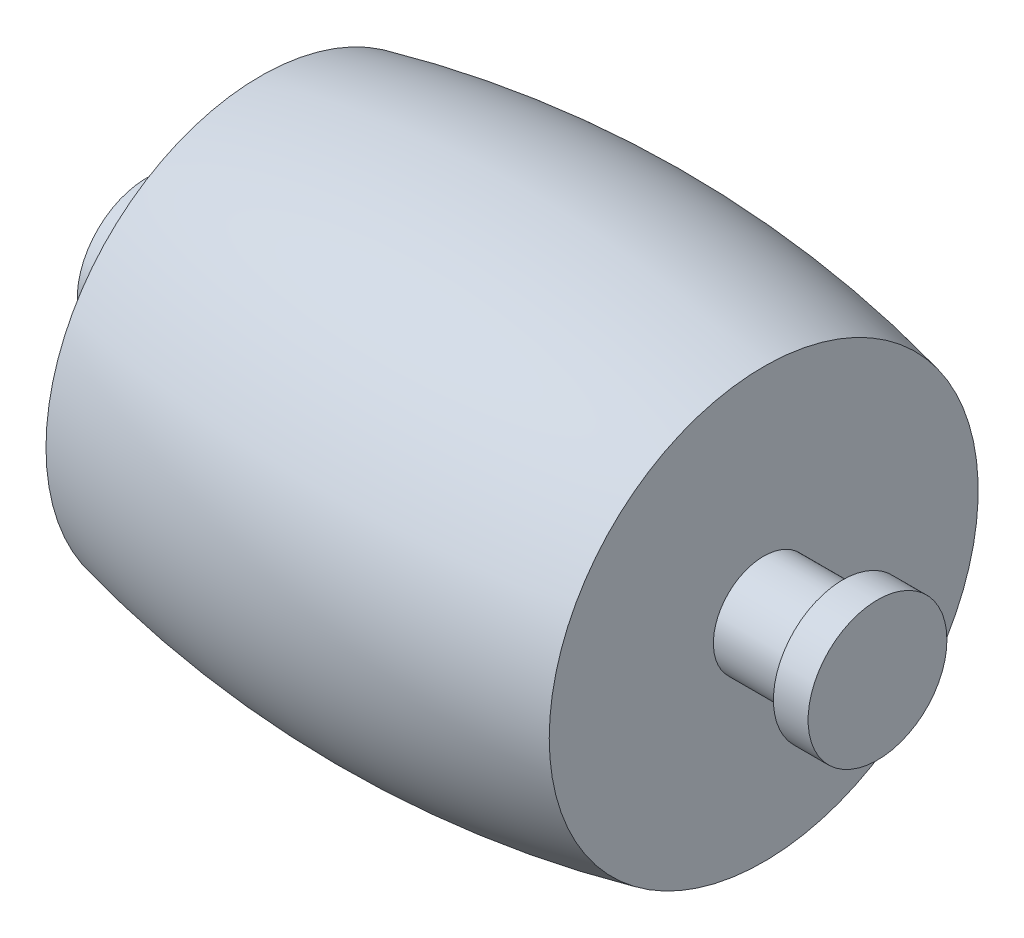
ISO-10303-21;
HEADER;
FILE_DESCRIPTION(('STEP AP214'),'2;1');
FILE_NAME('part.step','',(''),(''),'','','');
FILE_SCHEMA(('AUTOMOTIVE_DESIGN { 1 0 10303 214 1 1 1 1 }'));
ENDSEC;
DATA;
#1=APPLICATION_CONTEXT('core data for automotive mechanical design processes');
#2=APPLICATION_PROTOCOL_DEFINITION('international standard','automotive_design',2000,#1);
#3=PRODUCT_CONTEXT('',#1,'mechanical');
#4=PRODUCT('Part','Part','',(#3));
#5=PRODUCT_RELATED_PRODUCT_CATEGORY('part','',(#4));
#6=PRODUCT_DEFINITION_FORMATION('','',#4);
#7=PRODUCT_DEFINITION_CONTEXT('part definition',#1,'design');
#8=PRODUCT_DEFINITION('design','',#6,#7);
#9=PRODUCT_DEFINITION_SHAPE('','',#8);
#10=(LENGTH_UNIT() NAMED_UNIT(*) SI_UNIT(.MILLI.,.METRE.));
#11=(NAMED_UNIT(*) PLANE_ANGLE_UNIT() SI_UNIT($,.RADIAN.));
#12=(NAMED_UNIT(*) SI_UNIT($,.STERADIAN.) SOLID_ANGLE_UNIT());
#13=UNCERTAINTY_MEASURE_WITH_UNIT(LENGTH_MEASURE(1.E-05),#10,'distance_accuracy_value','');
#14=(GEOMETRIC_REPRESENTATION_CONTEXT(3) GLOBAL_UNCERTAINTY_ASSIGNED_CONTEXT((#13)) GLOBAL_UNIT_ASSIGNED_CONTEXT((#10,
#11,#12)) REPRESENTATION_CONTEXT('',''));
#15=CARTESIAN_POINT('',(0.,0.,0.));
#16=DIRECTION('',(0.,0.,1.));
#17=DIRECTION('',(1.,0.,0.));
#18=AXIS2_PLACEMENT_3D('',#15,#16,#17);
#19=CARTESIAN_POINT('',(-18.415,0.,0.));
#20=DIRECTION('',(1.,0.,0.));
#21=DIRECTION('',(0.,0.,-1.));
#22=AXIS2_PLACEMENT_3D('',#19,#20,#21);
#23=PLANE('',#22);
#24=CARTESIAN_POINT('',(-18.415,0.,0.));
#25=DIRECTION('',(1.,0.,0.));
#26=DIRECTION('',(0.,0.,-1.));
#27=AXIS2_PLACEMENT_3D('',#24,#25,#26);
#28=CIRCLE('',#27,3.683);
#29=CARTESIAN_POINT('',(-18.415,0.,-3.683));
#30=VERTEX_POINT('',#29);
#31=EDGE_CURVE('E71',#30,#30,#28,.T.);
#32=ORIENTED_EDGE('',*,*,#31,.T.);
#33=EDGE_LOOP('',(#32));
#34=FACE_BOUND('',#33,.T.);
#35=CARTESIAN_POINT('',(-18.415,0.,0.));
#36=DIRECTION('',(-1.,0.,0.));
#37=DIRECTION('',(0.,0.,1.));
#38=AXIS2_PLACEMENT_3D('',#35,#36,#37);
#39=CIRCLE('',#38,15.6975725106249);
#40=CARTESIAN_POINT('',(-18.415,0.,15.6975725106249));
#41=VERTEX_POINT('',#40);
#42=EDGE_CURVE('E40',#41,#41,#39,.T.);
#43=ORIENTED_EDGE('',*,*,#42,.T.);
#44=EDGE_LOOP('',(#43));
#45=FACE_BOUND('',#44,.T.);
#46=ADVANCED_FACE('F37',(#34,#45),#23,.F.);
#47=CARTESIAN_POINT('',(0.,0.,0.));
#48=DIRECTION('',(-1.,0.,0.));
#49=DIRECTION('',(0.,0.,1.));
#50=AXIS2_PLACEMENT_3D('',#47,#48,#49);
#51=DEGENERATE_TOROIDAL_SURFACE('',#50,64.683550592,82.463550592,.F.);
#52=ORIENTED_EDGE('',*,*,#42,.F.);
#53=EDGE_LOOP('',(#52));
#54=FACE_BOUND('',#53,.T.);
#55=CARTESIAN_POINT('',(18.415,0.,0.));
#56=DIRECTION('',(-1.,0.,0.));
#57=DIRECTION('',(0.,0.,1.));
#58=AXIS2_PLACEMENT_3D('',#55,#56,#57);
#59=CIRCLE('',#58,15.6975725106249);
#60=CARTESIAN_POINT('',(18.415,0.,15.6975725106249));
#61=VERTEX_POINT('',#60);
#62=EDGE_CURVE('E50',#61,#61,#59,.T.);
#63=ORIENTED_EDGE('',*,*,#62,.T.);
#64=EDGE_LOOP('',(#63));
#65=FACE_BOUND('',#64,.T.);
#66=ADVANCED_FACE('F105',(#54,#65),#51,.F.);
#67=CARTESIAN_POINT('',(18.415,0.,0.));
#68=DIRECTION('',(-1.,0.,0.));
#69=DIRECTION('',(0.,0.,1.));
#70=AXIS2_PLACEMENT_3D('',#67,#68,#69);
#71=PLANE('',#70);
#72=CARTESIAN_POINT('',(18.415,0.,0.));
#73=DIRECTION('',(1.,0.,0.));
#74=DIRECTION('',(0.,0.,-1.));
#75=AXIS2_PLACEMENT_3D('',#72,#73,#74);
#76=CIRCLE('',#75,3.683);
#77=CARTESIAN_POINT('',(18.415,0.,-3.683));
#78=VERTEX_POINT('',#77);
#79=EDGE_CURVE('E10',#78,#78,#76,.T.);
#80=ORIENTED_EDGE('',*,*,#79,.F.);
#81=EDGE_LOOP('',(#80));
#82=FACE_BOUND('',#81,.T.);
#83=ORIENTED_EDGE('',*,*,#62,.F.);
#84=EDGE_LOOP('',(#83));
#85=FACE_BOUND('',#84,.T.);
#86=ADVANCED_FACE('F110',(#82,#85),#71,.F.);
#87=CARTESIAN_POINT('',(24.204022458,0.,0.));
#88=DIRECTION('',(-1.,0.,0.));
#89=DIRECTION('',(0.,0.,1.));
#90=AXIS2_PLACEMENT_3D('',#87,#88,#89);
#91=CYLINDRICAL_SURFACE('',#90,3.683);
#92=CARTESIAN_POINT('',(24.204022458,0.,0.));
#93=DIRECTION('',(1.,0.,0.));
#94=DIRECTION('',(0.,0.,-1.));
#95=AXIS2_PLACEMENT_3D('',#92,#93,#94);
#96=CIRCLE('',#95,3.683);
#97=CARTESIAN_POINT('',(24.204022458,0.,-3.683));
#98=VERTEX_POINT('',#97);
#99=EDGE_CURVE('E52',#98,#98,#96,.T.);
#100=ORIENTED_EDGE('',*,*,#99,.F.);
#101=EDGE_LOOP('',(#100));
#102=FACE_BOUND('',#101,.T.);
#103=ORIENTED_EDGE('',*,*,#79,.T.);
#104=EDGE_LOOP('',(#103));
#105=FACE_BOUND('',#104,.T.);
#106=ADVANCED_FACE('F131',(#102,#105),#91,.T.);
#107=CARTESIAN_POINT('',(26.744022458,0.,0.));
#108=DIRECTION('',(-1.,0.,0.));
#109=DIRECTION('',(0.,0.,1.));
#110=AXIS2_PLACEMENT_3D('',#107,#108,#109);
#111=CYLINDRICAL_SURFACE('',#110,5.08);
#112=CARTESIAN_POINT('',(26.744022458,0.,0.));
#113=DIRECTION('',(1.,0.,0.));
#114=DIRECTION('',(0.,0.,-1.));
#115=AXIS2_PLACEMENT_3D('',#112,#113,#114);
#116=CIRCLE('',#115,5.08);
#117=CARTESIAN_POINT('',(26.744022458,0.,-5.08));
#118=VERTEX_POINT('',#117);
#119=EDGE_CURVE('E60',#118,#118,#116,.T.);
#120=ORIENTED_EDGE('',*,*,#119,.F.);
#121=EDGE_LOOP('',(#120));
#122=FACE_BOUND('',#121,.T.);
#123=CARTESIAN_POINT('',(24.204022458,0.,0.));
#124=DIRECTION('',(1.,0.,0.));
#125=DIRECTION('',(0.,0.,-1.));
#126=AXIS2_PLACEMENT_3D('',#123,#124,#125);
#127=CIRCLE('',#126,5.08);
#128=CARTESIAN_POINT('',(24.204022458,0.,-5.08));
#129=VERTEX_POINT('',#128);
#130=EDGE_CURVE('E65',#129,#129,#127,.T.);
#131=ORIENTED_EDGE('',*,*,#130,.T.);
#132=EDGE_LOOP('',(#131));
#133=FACE_BOUND('',#132,.T.);
#134=ADVANCED_FACE('F127',(#122,#133),#111,.T.);
#135=CARTESIAN_POINT('',(26.744022458,0.,0.));
#136=DIRECTION('',(1.,0.,0.));
#137=DIRECTION('',(0.,0.,-1.));
#138=AXIS2_PLACEMENT_3D('',#135,#136,#137);
#139=PLANE('',#138);
#140=ORIENTED_EDGE('',*,*,#119,.T.);
#141=EDGE_LOOP('',(#140));
#142=FACE_BOUND('',#141,.T.);
#143=ADVANCED_FACE('F123',(#142),#139,.T.);
#144=CARTESIAN_POINT('',(24.204022458,0.,0.));
#145=DIRECTION('',(1.,0.,0.));
#146=DIRECTION('',(0.,0.,-1.));
#147=AXIS2_PLACEMENT_3D('',#144,#145,#146);
#148=PLANE('',#147);
#149=ORIENTED_EDGE('',*,*,#99,.T.);
#150=EDGE_LOOP('',(#149));
#151=FACE_BOUND('',#150,.T.);
#152=ORIENTED_EDGE('',*,*,#130,.F.);
#153=EDGE_LOOP('',(#152));
#154=FACE_BOUND('',#153,.T.);
#155=ADVANCED_FACE('F117',(#151,#154),#148,.F.);
#156=CARTESIAN_POINT('',(-24.204022458,0.,0.));
#157=DIRECTION('',(1.,0.,0.));
#158=DIRECTION('',(0.,0.,-1.));
#159=AXIS2_PLACEMENT_3D('',#156,#157,#158);
#160=CYLINDRICAL_SURFACE('',#159,3.683);
#161=CARTESIAN_POINT('',(-24.204022458,0.,0.));
#162=DIRECTION('',(1.,0.,0.));
#163=DIRECTION('',(0.,0.,-1.));
#164=AXIS2_PLACEMENT_3D('',#161,#162,#163);
#165=CIRCLE('',#164,3.683);
#166=CARTESIAN_POINT('',(-24.204022458,0.,-3.683));
#167=VERTEX_POINT('',#166);
#168=EDGE_CURVE('E76',#167,#167,#165,.T.);
#169=ORIENTED_EDGE('',*,*,#168,.T.);
#170=EDGE_LOOP('',(#169));
#171=FACE_BOUND('',#170,.T.);
#172=ORIENTED_EDGE('',*,*,#31,.F.);
#173=EDGE_LOOP('',(#172));
#174=FACE_BOUND('',#173,.T.);
#175=ADVANCED_FACE('F102',(#171,#174),#160,.T.);
#176=CARTESIAN_POINT('',(-26.744022458,0.,0.));
#177=DIRECTION('',(1.,0.,0.));
#178=DIRECTION('',(0.,0.,-1.));
#179=AXIS2_PLACEMENT_3D('',#176,#177,#178);
#180=CYLINDRICAL_SURFACE('',#179,5.08);
#181=CARTESIAN_POINT('',(-26.744022458,0.,0.));
#182=DIRECTION('',(1.,0.,0.));
#183=DIRECTION('',(0.,0.,-1.));
#184=AXIS2_PLACEMENT_3D('',#181,#182,#183);
#185=CIRCLE('',#184,5.08);
#186=CARTESIAN_POINT('',(-26.744022458,0.,-5.08));
#187=VERTEX_POINT('',#186);
#188=EDGE_CURVE('E80',#187,#187,#185,.T.);
#189=ORIENTED_EDGE('',*,*,#188,.T.);
#190=EDGE_LOOP('',(#189));
#191=FACE_BOUND('',#190,.T.);
#192=CARTESIAN_POINT('',(-24.204022458,0.,0.));
#193=DIRECTION('',(1.,0.,0.));
#194=DIRECTION('',(0.,0.,-1.));
#195=AXIS2_PLACEMENT_3D('',#192,#193,#194);
#196=CIRCLE('',#195,5.08);
#197=CARTESIAN_POINT('',(-24.204022458,0.,-5.08));
#198=VERTEX_POINT('',#197);
#199=EDGE_CURVE('E81',#198,#198,#196,.T.);
#200=ORIENTED_EDGE('',*,*,#199,.F.);
#201=EDGE_LOOP('',(#200));
#202=FACE_BOUND('',#201,.T.);
#203=ADVANCED_FACE('F89',(#191,#202),#180,.T.);
#204=CARTESIAN_POINT('',(-26.744022458,0.,0.));
#205=DIRECTION('',(-1.,0.,0.));
#206=DIRECTION('',(0.,0.,-1.));
#207=AXIS2_PLACEMENT_3D('',#204,#205,#206);
#208=PLANE('',#207);
#209=ORIENTED_EDGE('',*,*,#188,.F.);
#210=EDGE_LOOP('',(#209));
#211=FACE_BOUND('',#210,.T.);
#212=ADVANCED_FACE('F92',(#211),#208,.T.);
#213=CARTESIAN_POINT('',(-24.204022458,0.,0.));
#214=DIRECTION('',(-1.,0.,0.));
#215=DIRECTION('',(0.,0.,-1.));
#216=AXIS2_PLACEMENT_3D('',#213,#214,#215);
#217=PLANE('',#216);
#218=ORIENTED_EDGE('',*,*,#168,.F.);
#219=EDGE_LOOP('',(#218));
#220=FACE_BOUND('',#219,.T.);
#221=ORIENTED_EDGE('',*,*,#199,.T.);
#222=EDGE_LOOP('',(#221));
#223=FACE_BOUND('',#222,.T.);
#224=ADVANCED_FACE('F94',(#220,#223),#217,.F.);
#225=CLOSED_SHELL('',(#46,#66,#86,#106,#134,#143,#155,#175,#203,#212,#224));
#226=MANIFOLD_SOLID_BREP('B2',#225);
#227=ADVANCED_BREP_SHAPE_REPRESENTATION('',(#18,#226),#14);
#228=SHAPE_DEFINITION_REPRESENTATION(#9,#227);
ENDSEC;
END-ISO-10303-21;
